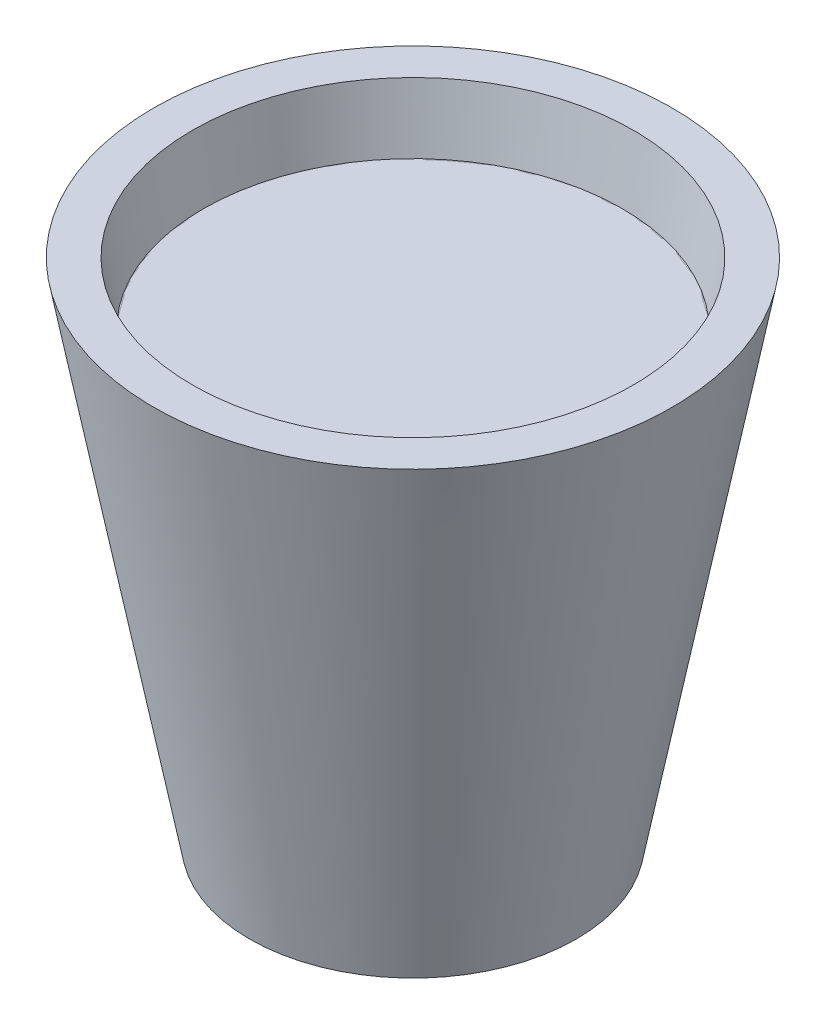
ISO-10303-21;
HEADER;
FILE_DESCRIPTION(('STEP AP214'),'2;1');
FILE_NAME('part.step','',(''),(''),'','','');
FILE_SCHEMA(('AUTOMOTIVE_DESIGN { 1 0 10303 214 1 1 1 1 }'));
ENDSEC;
DATA;
#1=APPLICATION_CONTEXT('core data for automotive mechanical design processes');
#2=APPLICATION_PROTOCOL_DEFINITION('international standard','automotive_design',2000,#1);
#3=PRODUCT_CONTEXT('',#1,'mechanical');
#4=PRODUCT('Part','Part','',(#3));
#5=PRODUCT_RELATED_PRODUCT_CATEGORY('part','',(#4));
#6=PRODUCT_DEFINITION_FORMATION('','',#4);
#7=PRODUCT_DEFINITION_CONTEXT('part definition',#1,'design');
#8=PRODUCT_DEFINITION('design','',#6,#7);
#9=PRODUCT_DEFINITION_SHAPE('','',#8);
#10=(LENGTH_UNIT() NAMED_UNIT(*) SI_UNIT(.MILLI.,.METRE.));
#11=(NAMED_UNIT(*) PLANE_ANGLE_UNIT() SI_UNIT($,.RADIAN.));
#12=(NAMED_UNIT(*) SI_UNIT($,.STERADIAN.) SOLID_ANGLE_UNIT());
#13=UNCERTAINTY_MEASURE_WITH_UNIT(LENGTH_MEASURE(1.E-05),#10,'distance_accuracy_value','');
#14=(GEOMETRIC_REPRESENTATION_CONTEXT(3) GLOBAL_UNCERTAINTY_ASSIGNED_CONTEXT((#13)) GLOBAL_UNIT_ASSIGNED_CONTEXT((#10,
#11,#12)) REPRESENTATION_CONTEXT('',''));
#15=CARTESIAN_POINT('',(0.,0.,0.));
#16=DIRECTION('',(0.,0.,1.));
#17=DIRECTION('',(1.,0.,0.));
#18=AXIS2_PLACEMENT_3D('',#15,#16,#17);
#19=CARTESIAN_POINT('',(0.,88.9,0.));
#20=DIRECTION('',(0.,1.,0.));
#21=DIRECTION('',(-1.,0.,0.));
#22=AXIS2_PLACEMENT_3D('',#19,#20,#21);
#23=CONICAL_SURFACE('',#22,38.5677054572346,0.174532925199433);
#24=CARTESIAN_POINT('',(0.,7.87400000000001,0.));
#25=DIRECTION('',(0.,1.,0.));
#26=DIRECTION('',(-1.,0.,0.));
#27=AXIS2_PLACEMENT_3D('',#24,#25,#26);
#28=CIRCLE('',#27,24.2806355183504);
#29=CARTESIAN_POINT('',(-24.2806355183504,7.87400000000001,0.));
#30=VERTEX_POINT('',#29);
#31=EDGE_CURVE('E11',#30,#30,#28,.T.);
#32=ORIENTED_EDGE('',*,*,#31,.T.);
#33=EDGE_LOOP('',(#32));
#34=FACE_BOUND('',#33,.T.);
#35=CARTESIAN_POINT('',(0.,77.978,0.));
#36=DIRECTION('',(0.,1.,0.));
#37=DIRECTION('',(-1.,0.,0.));
#38=AXIS2_PLACEMENT_3D('',#35,#36,#37);
#39=CIRCLE('',#38,36.6418621739367);
#40=CARTESIAN_POINT('',(-36.6418621739367,77.978,0.));
#41=VERTEX_POINT('',#40);
#42=EDGE_CURVE('E47',#41,#41,#39,.T.);
#43=ORIENTED_EDGE('',*,*,#42,.F.);
#44=EDGE_LOOP('',(#43));
#45=FACE_BOUND('',#44,.T.);
#46=ADVANCED_FACE('F41',(#34,#45),#23,.T.);
#47=CARTESIAN_POINT('',(0.,7.87400000000001,0.));
#48=DIRECTION('',(0.,1.,0.));
#49=DIRECTION('',(-1.,0.,0.));
#50=AXIS2_PLACEMENT_3D('',#47,#48,#49);
#51=PLANE('',#50);
#52=ORIENTED_EDGE('',*,*,#31,.F.);
#53=EDGE_LOOP('',(#52));
#54=FACE_BOUND('',#53,.T.);
#55=ADVANCED_FACE('F56',(#54),#51,.F.);
#56=CARTESIAN_POINT('',(0.,77.978,0.));
#57=DIRECTION('',(0.,1.,0.));
#58=DIRECTION('',(-1.,0.,0.));
#59=AXIS2_PLACEMENT_3D('',#56,#57,#58);
#60=PLANE('',#59);
#61=ORIENTED_EDGE('',*,*,#42,.T.);
#62=EDGE_LOOP('',(#61));
#63=FACE_BOUND('',#62,.T.);
#64=ADVANCED_FACE('F53',(#63),#60,.T.);
#65=CLOSED_SHELL('',(#46,#55,#64));
#66=MANIFOLD_SOLID_BREP('B2',#65);
#67=CARTESIAN_POINT('',(0.,0.,0.));
#68=DIRECTION('',(0.,1.,0.));
#69=DIRECTION('',(-1.,0.,0.));
#70=AXIS2_PLACEMENT_3D('',#67,#68,#69);
#71=PLANE('',#70);
#72=CARTESIAN_POINT('',(0.,0.,0.));
#73=DIRECTION('',(0.,1.,0.));
#74=DIRECTION('',(-1.,0.,0.));
#75=AXIS2_PLACEMENT_3D('',#72,#73,#74);
#76=CIRCLE('',#75,28.575);
#77=CARTESIAN_POINT('',(-28.575,0.,0.));
#78=VERTEX_POINT('',#77);
#79=EDGE_CURVE('E40',#78,#78,#76,.T.);
#80=ORIENTED_EDGE('',*,*,#79,.F.);
#81=EDGE_LOOP('',(#80));
#82=FACE_BOUND('',#81,.T.);
#83=ADVANCED_FACE('F82',(#82),#71,.F.);
#84=CARTESIAN_POINT('',(0.,0.,0.));
#85=DIRECTION('',(0.,1.,0.));
#86=DIRECTION('',(-1.,0.,0.));
#87=AXIS2_PLACEMENT_3D('',#84,#85,#86);
#88=CONICAL_SURFACE('',#87,28.575,0.18629301437045);
#89=CARTESIAN_POINT('',(0.,88.9,0.));
#90=DIRECTION('',(0.,1.,0.));
#91=DIRECTION('',(-1.,0.,0.));
#92=AXIS2_PLACEMENT_3D('',#89,#90,#91);
#93=CIRCLE('',#92,45.3307353579175);
#94=CARTESIAN_POINT('',(-45.3307353579175,88.9,0.));
#95=VERTEX_POINT('',#94);
#96=EDGE_CURVE('E89',#95,#95,#93,.T.);
#97=ORIENTED_EDGE('',*,*,#96,.F.);
#98=EDGE_LOOP('',(#97));
#99=FACE_BOUND('',#98,.T.);
#100=ORIENTED_EDGE('',*,*,#79,.T.);
#101=EDGE_LOOP('',(#100));
#102=FACE_BOUND('',#101,.T.);
#103=ADVANCED_FACE('F111',(#99,#102),#88,.T.);
#104=CARTESIAN_POINT('',(45.3307353579175,88.9,0.));
#105=DIRECTION('',(0.,-1.,0.));
#106=DIRECTION('',(1.,0.,0.));
#107=AXIS2_PLACEMENT_3D('',#104,#105,#106);
#108=PLANE('',#107);
#109=CARTESIAN_POINT('',(0.,88.9,0.));
#110=DIRECTION('',(0.,1.,0.));
#111=DIRECTION('',(-1.,0.,0.));
#112=AXIS2_PLACEMENT_3D('',#109,#110,#111);
#113=CIRCLE('',#112,38.5677054572346);
#114=CARTESIAN_POINT('',(-38.5677054572346,88.9,0.));
#115=VERTEX_POINT('',#114);
#116=EDGE_CURVE('E101',#115,#115,#113,.T.);
#117=ORIENTED_EDGE('',*,*,#116,.F.);
#118=EDGE_LOOP('',(#117));
#119=FACE_BOUND('',#118,.T.);
#120=ORIENTED_EDGE('',*,*,#96,.T.);
#121=EDGE_LOOP('',(#120));
#122=FACE_BOUND('',#121,.T.);
#123=ADVANCED_FACE('F107',(#119,#122),#108,.F.);
#124=CARTESIAN_POINT('',(0.,77.978,0.));
#125=DIRECTION('',(0.,1.,0.));
#126=DIRECTION('',(-1.,0.,0.));
#127=AXIS2_PLACEMENT_3D('',#124,#125,#126);
#128=PLANE('',#127);
#129=CARTESIAN_POINT('',(0.,77.978,0.));
#130=DIRECTION('',(0.,1.,0.));
#131=DIRECTION('',(-1.,0.,0.));
#132=AXIS2_PLACEMENT_3D('',#129,#130,#131);
#133=CIRCLE('',#132,36.6418621739367);
#134=CARTESIAN_POINT('',(-36.6418621739367,77.978,0.));
#135=VERTEX_POINT('',#134);
#136=EDGE_CURVE('E98',#135,#135,#133,.T.);
#137=ORIENTED_EDGE('',*,*,#136,.T.);
#138=EDGE_LOOP('',(#137));
#139=FACE_BOUND('',#138,.T.);
#140=CARTESIAN_POINT('',(0.,77.978,0.));
#141=DIRECTION('',(0.,1.,0.));
#142=DIRECTION('',(-1.,0.,0.));
#143=AXIS2_PLACEMENT_3D('',#140,#141,#142);
#144=CIRCLE('',#143,36.4423759857012);
#145=CARTESIAN_POINT('',(-36.4423759857012,77.978,0.));
#146=VERTEX_POINT('',#145);
#147=EDGE_CURVE('E85',#146,#146,#144,.F.);
#148=ORIENTED_EDGE('',*,*,#147,.T.);
#149=EDGE_LOOP('',(#148));
#150=FACE_BOUND('',#149,.T.);
#151=ADVANCED_FACE('F110',(#139,#150),#128,.T.);
#152=CARTESIAN_POINT('',(0.,88.9,0.));
#153=DIRECTION('',(0.,1.,0.));
#154=DIRECTION('',(-1.,0.,0.));
#155=AXIS2_PLACEMENT_3D('',#152,#153,#154);
#156=CONICAL_SURFACE('',#155,38.5677054572346,0.174532925199433);
#157=ORIENTED_EDGE('',*,*,#136,.F.);
#158=EDGE_LOOP('',(#157));
#159=FACE_BOUND('',#158,.T.);
#160=ORIENTED_EDGE('',*,*,#116,.T.);
#161=EDGE_LOOP('',(#160));
#162=FACE_BOUND('',#161,.T.);
#163=ADVANCED_FACE('F105',(#159,#162),#156,.F.);
#164=CARTESIAN_POINT('',(22.889249358694,8.32891688001841,0.));
#165=DIRECTION('',(0.,-1.,0.));
#166=DIRECTION('',(1.,0.,0.));
#167=AXIS2_PLACEMENT_3D('',#164,#165,#166);
#168=PLANE('',#167);
#169=CARTESIAN_POINT('',(0.,8.32891688001841,0.));
#170=DIRECTION('',(0.,1.,0.));
#171=DIRECTION('',(-1.,0.,0.));
#172=AXIS2_PLACEMENT_3D('',#169,#170,#171);
#173=CIRCLE('',#172,22.889249358694);
#174=CARTESIAN_POINT('',(-22.889249358694,8.32891688001841,0.));
#175=VERTEX_POINT('',#174);
#176=EDGE_CURVE('E93',#175,#175,#173,.T.);
#177=ORIENTED_EDGE('',*,*,#176,.T.);
#178=EDGE_LOOP('',(#177));
#179=FACE_BOUND('',#178,.T.);
#180=ADVANCED_FACE('F124',(#179),#168,.F.);
#181=CARTESIAN_POINT('',(0.,88.9,0.));
#182=DIRECTION('',(0.,1.,0.));
#183=DIRECTION('',(-1.,0.,0.));
#184=AXIS2_PLACEMENT_3D('',#181,#182,#183);
#185=CONICAL_SURFACE('',#184,38.5677054572346,0.192189809269485);
#186=ORIENTED_EDGE('',*,*,#176,.F.);
#187=EDGE_LOOP('',(#186));
#188=FACE_BOUND('',#187,.T.);
#189=ORIENTED_EDGE('',*,*,#147,.F.);
#190=EDGE_LOOP('',(#189));
#191=FACE_BOUND('',#190,.T.);
#192=ADVANCED_FACE('F121',(#188,#191),#185,.F.);
#193=CLOSED_SHELL('',(#83,#103,#123,#151,#163,#180,#192));
#194=MANIFOLD_SOLID_BREP('B6',#193);
#195=ADVANCED_BREP_SHAPE_REPRESENTATION('',(#18,#66,#194),#14);
#196=SHAPE_DEFINITION_REPRESENTATION(#9,#195);
ENDSEC;
END-ISO-10303-21;
